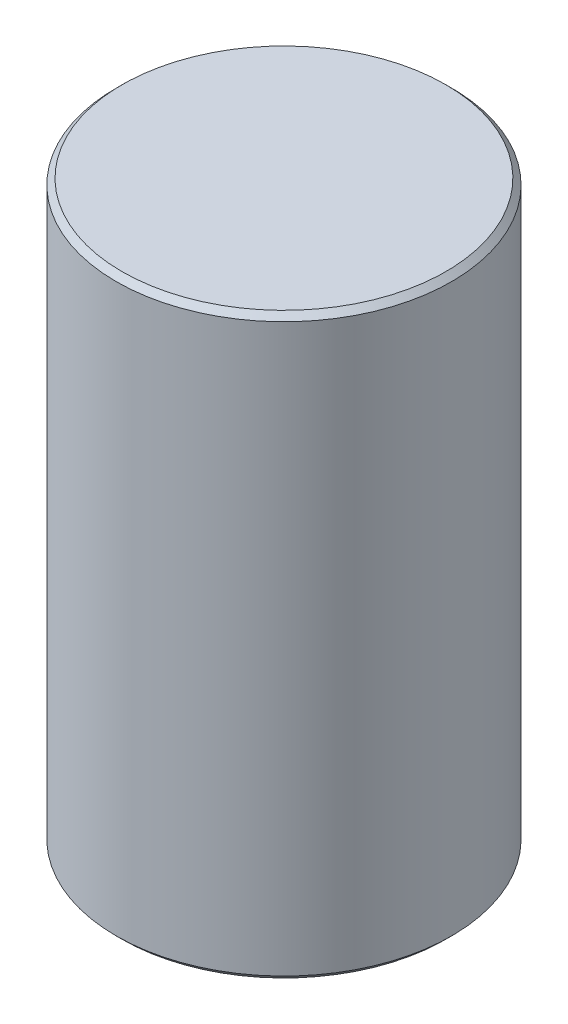
ISO-10303-21;
HEADER;
FILE_DESCRIPTION(('STEP AP214'),'2;1');
FILE_NAME('part.step','',(''),(''),'','','');
FILE_SCHEMA(('AUTOMOTIVE_DESIGN { 1 0 10303 214 1 1 1 1 }'));
ENDSEC;
DATA;
#1=APPLICATION_CONTEXT('core data for automotive mechanical design processes');
#2=APPLICATION_PROTOCOL_DEFINITION('international standard','automotive_design',2000,#1);
#3=PRODUCT_CONTEXT('',#1,'mechanical');
#4=PRODUCT('Part','Part','',(#3));
#5=PRODUCT_RELATED_PRODUCT_CATEGORY('part','',(#4));
#6=PRODUCT_DEFINITION_FORMATION('','',#4);
#7=PRODUCT_DEFINITION_CONTEXT('part definition',#1,'design');
#8=PRODUCT_DEFINITION('design','',#6,#7);
#9=PRODUCT_DEFINITION_SHAPE('','',#8);
#10=(LENGTH_UNIT() NAMED_UNIT(*) SI_UNIT(.MILLI.,.METRE.));
#11=(NAMED_UNIT(*) PLANE_ANGLE_UNIT() SI_UNIT($,.RADIAN.));
#12=(NAMED_UNIT(*) SI_UNIT($,.STERADIAN.) SOLID_ANGLE_UNIT());
#13=UNCERTAINTY_MEASURE_WITH_UNIT(LENGTH_MEASURE(1.E-05),#10,'distance_accuracy_value','');
#14=(GEOMETRIC_REPRESENTATION_CONTEXT(3) GLOBAL_UNCERTAINTY_ASSIGNED_CONTEXT((#13)) GLOBAL_UNIT_ASSIGNED_CONTEXT((#10,
#11,#12)) REPRESENTATION_CONTEXT('',''));
#15=CARTESIAN_POINT('',(0.,0.,0.));
#16=DIRECTION('',(0.,0.,1.));
#17=DIRECTION('',(1.,0.,0.));
#18=AXIS2_PLACEMENT_3D('',#15,#16,#17);
#19=CARTESIAN_POINT('',(0.,50.,0.));
#20=DIRECTION('',(0.,-1.,0.));
#21=DIRECTION('',(0.,0.,-1.));
#22=AXIS2_PLACEMENT_3D('',#19,#20,#21);
#23=CYLINDRICAL_SURFACE('',#22,14.5);
#24=CARTESIAN_POINT('',(0.,0.500000000000007,0.));
#25=DIRECTION('',(0.,1.,0.));
#26=DIRECTION('',(0.,0.,1.));
#27=AXIS2_PLACEMENT_3D('',#24,#25,#26);
#28=CIRCLE('',#27,14.5);
#29=CARTESIAN_POINT('',(0.,0.500000000000007,14.5));
#30=VERTEX_POINT('',#29);
#31=EDGE_CURVE('E567',#30,#30,#28,.T.);
#32=ORIENTED_EDGE('',*,*,#31,.T.);
#33=EDGE_LOOP('',(#32));
#34=FACE_BOUND('',#33,.T.);
#35=CARTESIAN_POINT('',(0.,49.5,0.));
#36=DIRECTION('',(0.,1.,0.));
#37=DIRECTION('',(0.,0.,1.));
#38=AXIS2_PLACEMENT_3D('',#35,#36,#37);
#39=CIRCLE('',#38,14.5);
#40=CARTESIAN_POINT('',(0.,49.5,14.5));
#41=VERTEX_POINT('',#40);
#42=EDGE_CURVE('E564',#41,#41,#39,.F.);
#43=ORIENTED_EDGE('',*,*,#42,.T.);
#44=EDGE_LOOP('',(#43));
#45=FACE_BOUND('',#44,.T.);
#46=ADVANCED_FACE('F137',(#34,#45),#23,.T.);
#47=CARTESIAN_POINT('',(0.,50.,0.));
#48=DIRECTION('',(0.,1.,0.));
#49=DIRECTION('',(0.,0.,1.));
#50=AXIS2_PLACEMENT_3D('',#47,#48,#49);
#51=PLANE('',#50);
#52=CARTESIAN_POINT('',(0.,50.,0.));
#53=DIRECTION('',(0.,1.,0.));
#54=DIRECTION('',(0.,0.,1.));
#55=AXIS2_PLACEMENT_3D('',#52,#53,#54);
#56=CIRCLE('',#55,14.);
#57=CARTESIAN_POINT('',(0.,50.,14.));
#58=VERTEX_POINT('',#57);
#59=EDGE_CURVE('E568',#58,#58,#56,.T.);
#60=ORIENTED_EDGE('',*,*,#59,.T.);
#61=EDGE_LOOP('',(#60));
#62=FACE_BOUND('',#61,.T.);
#63=ADVANCED_FACE('F472',(#62),#51,.T.);
#64=CARTESIAN_POINT('',(0.,0.,0.));
#65=DIRECTION('',(0.,1.,0.));
#66=DIRECTION('',(0.,0.,1.));
#67=AXIS2_PLACEMENT_3D('',#64,#65,#66);
#68=PLANE('',#67);
#69=CARTESIAN_POINT('',(0.,0.,0.));
#70=DIRECTION('',(0.,1.,0.));
#71=DIRECTION('',(0.,0.,1.));
#72=AXIS2_PLACEMENT_3D('',#69,#70,#71);
#73=CIRCLE('',#72,14.);
#74=CARTESIAN_POINT('',(0.,0.,14.));
#75=VERTEX_POINT('',#74);
#76=EDGE_CURVE('E342',#75,#75,#73,.F.);
#77=ORIENTED_EDGE('',*,*,#76,.T.);
#78=EDGE_LOOP('',(#77));
#79=FACE_BOUND('',#78,.T.);
#80=CARTESIAN_POINT('',(0.,0.,-12.7817252356636));
#81=DIRECTION('',(0.,-1.,0.));
#82=DIRECTION('',(0.,0.,-1.));
#83=AXIS2_PLACEMENT_3D('',#80,#81,#82);
#84=CIRCLE('',#83,1.1);
#85=CARTESIAN_POINT('',(0.,0.,-13.8817252356636));
#86=VERTEX_POINT('',#85);
#87=EDGE_CURVE('E744',#86,#86,#84,.T.);
#88=ORIENTED_EDGE('',*,*,#87,.F.);
#89=EDGE_LOOP('',(#88));
#90=FACE_BOUND('',#89,.T.);
#91=CARTESIAN_POINT('',(0.,0.,12.7817252356636));
#92=DIRECTION('',(0.,-1.,0.));
#93=DIRECTION('',(0.,0.,-1.));
#94=AXIS2_PLACEMENT_3D('',#91,#92,#93);
#95=CIRCLE('',#94,1.1);
#96=CARTESIAN_POINT('',(0.,0.,11.6817252356636));
#97=VERTEX_POINT('',#96);
#98=EDGE_CURVE('E674',#97,#97,#95,.T.);
#99=ORIENTED_EDGE('',*,*,#98,.F.);
#100=EDGE_LOOP('',(#99));
#101=FACE_BOUND('',#100,.T.);
#102=CARTESIAN_POINT('',(14.5,0.,0.));
#103=DIRECTION('',(0.,-1.,0.));
#104=DIRECTION('',(0.,0.,-1.));
#105=AXIS2_PLACEMENT_3D('',#102,#103,#104);
#106=CIRCLE('',#105,3.);
#107=CARTESIAN_POINT('',(11.6381823957492,0.,-0.9));
#108=VERTEX_POINT('',#107);
#109=CARTESIAN_POINT('',(13.022559490885,0.,-2.61097099601391));
#110=VERTEX_POINT('',#109);
#111=EDGE_CURVE('E577',#108,#110,#106,.T.);
#112=ORIENTED_EDGE('',*,*,#111,.T.);
#113=CARTESIAN_POINT('',(0.,0.,0.));
#114=DIRECTION('',(0.,1.,0.));
#115=DIRECTION('',(0.,0.,1.));
#116=AXIS2_PLACEMENT_3D('',#113,#114,#115);
#117=CIRCLE('',#116,13.2817252356636);
#118=CARTESIAN_POINT('',(2.99585149096341,0.,-12.9394396741032));
#119=VERTEX_POINT('',#118);
#120=EDGE_CURVE('E355',#110,#119,#117,.T.);
#121=ORIENTED_EDGE('',*,*,#120,.T.);
#122=CARTESIAN_POINT('',(0.,0.,-12.7817252356636));
#123=DIRECTION('',(0.,-1.,0.));
#124=DIRECTION('',(0.,0.,-1.));
#125=AXIS2_PLACEMENT_3D('',#122,#123,#124);
#126=CIRCLE('',#125,3.);
#127=CARTESIAN_POINT('',(-2.99585149096341,0.,-12.9394396741032));
#128=VERTEX_POINT('',#127);
#129=EDGE_CURVE('E584',#119,#128,#126,.T.);
#130=ORIENTED_EDGE('',*,*,#129,.T.);
#131=CARTESIAN_POINT('',(0.,0.,0.));
#132=DIRECTION('',(0.,1.,0.));
#133=DIRECTION('',(0.,0.,1.));
#134=AXIS2_PLACEMENT_3D('',#131,#132,#133);
#135=CIRCLE('',#134,13.2817252356636);
#136=CARTESIAN_POINT('',(-13.022559490885,0.,-2.61097099601391));
#137=VERTEX_POINT('',#136);
#138=EDGE_CURVE('E349',#128,#137,#135,.T.);
#139=ORIENTED_EDGE('',*,*,#138,.T.);
#140=CARTESIAN_POINT('',(-14.5,0.,0.));
#141=DIRECTION('',(0.,-1.,0.));
#142=DIRECTION('',(0.,0.,-1.));
#143=AXIS2_PLACEMENT_3D('',#140,#141,#142);
#144=CIRCLE('',#143,3.);
#145=CARTESIAN_POINT('',(-11.6381823957492,0.,-0.9));
#146=VERTEX_POINT('',#145);
#147=EDGE_CURVE('E592',#137,#146,#144,.T.);
#148=ORIENTED_EDGE('',*,*,#147,.T.);
#149=DIRECTION('',(1.,0.,0.));
#150=VECTOR('',#149,1.);
#151=CARTESIAN_POINT('',(0.,0.,-0.9));
#152=LINE('',#151,#150);
#153=CARTESIAN_POINT('',(-12.75,0.,-0.9));
#154=VERTEX_POINT('',#153);
#155=EDGE_CURVE('E328',#154,#146,#152,.T.);
#156=ORIENTED_EDGE('',*,*,#155,.F.);
#157=DIRECTION('',(0.,0.,1.));
#158=VECTOR('',#157,1.);
#159=CARTESIAN_POINT('',(-12.75,0.,0.));
#160=LINE('',#159,#158);
#161=CARTESIAN_POINT('',(-12.75,0.,0.9));
#162=VERTEX_POINT('',#161);
#163=EDGE_CURVE('E324',#154,#162,#160,.T.);
#164=ORIENTED_EDGE('',*,*,#163,.T.);
#165=DIRECTION('',(1.,0.,0.));
#166=VECTOR('',#165,1.);
#167=CARTESIAN_POINT('',(0.,0.,0.9));
#168=LINE('',#167,#166);
#169=CARTESIAN_POINT('',(-11.6381823957492,0.,0.9));
#170=VERTEX_POINT('',#169);
#171=EDGE_CURVE('E608',#162,#170,#168,.T.);
#172=ORIENTED_EDGE('',*,*,#171,.T.);
#173=CARTESIAN_POINT('',(-14.5,0.,0.));
#174=DIRECTION('',(0.,-1.,0.));
#175=DIRECTION('',(0.,0.,-1.));
#176=AXIS2_PLACEMENT_3D('',#173,#174,#175);
#177=CIRCLE('',#176,3.);
#178=CARTESIAN_POINT('',(-13.022559490885,0.,2.61097099601391));
#179=VERTEX_POINT('',#178);
#180=EDGE_CURVE('E606',#170,#179,#177,.T.);
#181=ORIENTED_EDGE('',*,*,#180,.T.);
#182=CARTESIAN_POINT('',(0.,0.,0.));
#183=DIRECTION('',(0.,1.,0.));
#184=DIRECTION('',(0.,0.,1.));
#185=AXIS2_PLACEMENT_3D('',#182,#183,#184);
#186=CIRCLE('',#185,13.2817252356636);
#187=CARTESIAN_POINT('',(-2.99585149096341,0.,12.9394396741032));
#188=VERTEX_POINT('',#187);
#189=EDGE_CURVE('E352',#179,#188,#186,.T.);
#190=ORIENTED_EDGE('',*,*,#189,.T.);
#191=CARTESIAN_POINT('',(0.,0.,12.7817252356636));
#192=DIRECTION('',(0.,-1.,0.));
#193=DIRECTION('',(0.,0.,-1.));
#194=AXIS2_PLACEMENT_3D('',#191,#192,#193);
#195=CIRCLE('',#194,3.);
#196=CARTESIAN_POINT('',(2.99585149096341,0.,12.9394396741032));
#197=VERTEX_POINT('',#196);
#198=EDGE_CURVE('E604',#188,#197,#195,.T.);
#199=ORIENTED_EDGE('',*,*,#198,.T.);
#200=CARTESIAN_POINT('',(0.,0.,0.));
#201=DIRECTION('',(0.,1.,0.));
#202=DIRECTION('',(0.,0.,1.));
#203=AXIS2_PLACEMENT_3D('',#200,#201,#202);
#204=CIRCLE('',#203,13.2817252356636);
#205=CARTESIAN_POINT('',(13.022559490885,0.,2.61097099601391));
#206=VERTEX_POINT('',#205);
#207=EDGE_CURVE('E346',#197,#206,#204,.T.);
#208=ORIENTED_EDGE('',*,*,#207,.T.);
#209=CARTESIAN_POINT('',(14.5,0.,0.));
#210=DIRECTION('',(0.,-1.,0.));
#211=DIRECTION('',(0.,0.,-1.));
#212=AXIS2_PLACEMENT_3D('',#209,#210,#211);
#213=CIRCLE('',#212,3.);
#214=CARTESIAN_POINT('',(11.6381823957492,0.,0.9));
#215=VERTEX_POINT('',#214);
#216=EDGE_CURVE('E601',#206,#215,#213,.T.);
#217=ORIENTED_EDGE('',*,*,#216,.T.);
#218=DIRECTION('',(1.,0.,0.));
#219=VECTOR('',#218,1.);
#220=CARTESIAN_POINT('',(0.,0.,0.9));
#221=LINE('',#220,#219);
#222=CARTESIAN_POINT('',(12.75,0.,0.9));
#223=VERTEX_POINT('',#222);
#224=EDGE_CURVE('E598',#215,#223,#221,.T.);
#225=ORIENTED_EDGE('',*,*,#224,.T.);
#226=DIRECTION('',(0.,0.,1.));
#227=VECTOR('',#226,1.);
#228=CARTESIAN_POINT('',(12.75,0.,0.));
#229=LINE('',#228,#227);
#230=CARTESIAN_POINT('',(12.75,0.,-0.9));
#231=VERTEX_POINT('',#230);
#232=EDGE_CURVE('E590',#231,#223,#229,.T.);
#233=ORIENTED_EDGE('',*,*,#232,.F.);
#234=DIRECTION('',(1.,0.,0.));
#235=VECTOR('',#234,1.);
#236=CARTESIAN_POINT('',(0.,0.,-0.9));
#237=LINE('',#236,#235);
#238=EDGE_CURVE('E588',#108,#231,#237,.T.);
#239=ORIENTED_EDGE('',*,*,#238,.F.);
#240=EDGE_LOOP('',(#112,#121,#130,#139,#148,#156,#164,#172,#181,#190,#199,#208,#217,#225,#233,#239));
#241=FACE_BOUND('',#240,.T.);
#242=ADVANCED_FACE('F478',(#79,#90,#101,#241),#68,.F.);
#243=CARTESIAN_POINT('',(0.,47.,-0.9));
#244=DIRECTION('',(0.,0.,-1.));
#245=DIRECTION('',(-1.,0.,0.));
#246=AXIS2_PLACEMENT_3D('',#243,#244,#245);
#247=PLANE('',#246);
#248=DIRECTION('',(1.,0.,0.));
#249=VECTOR('',#248,1.);
#250=CARTESIAN_POINT('',(0.,47.,-0.9));
#251=LINE('',#250,#249);
#252=CARTESIAN_POINT('',(-12.25,47.,-0.9));
#253=VERTEX_POINT('',#252);
#254=CARTESIAN_POINT('',(-11.6381823957492,47.,-0.9));
#255=VERTEX_POINT('',#254);
#256=EDGE_CURVE('E319',#253,#255,#251,.T.);
#257=ORIENTED_EDGE('',*,*,#256,.F.);
#258=DIRECTION('',(0.707106781186543,0.707106781186552,0.));
#259=VECTOR('',#258,1.);
#260=CARTESIAN_POINT('',(-12.75,46.5,-0.9));
#261=LINE('',#260,#259);
#262=CARTESIAN_POINT('',(-12.75,46.5,-0.9));
#263=VERTEX_POINT('',#262);
#264=EDGE_CURVE('E167',#253,#263,#261,.F.);
#265=ORIENTED_EDGE('',*,*,#264,.T.);
#266=DIRECTION('',(0.,-1.,0.));
#267=VECTOR('',#266,1.);
#268=CARTESIAN_POINT('',(-12.75,47.,-0.9));
#269=LINE('',#268,#267);
#270=EDGE_CURVE('E343',#263,#154,#269,.T.);
#271=ORIENTED_EDGE('',*,*,#270,.T.);
#272=ORIENTED_EDGE('',*,*,#155,.T.);
#273=DIRECTION('',(0.,-1.,0.));
#274=VECTOR('',#273,1.);
#275=CARTESIAN_POINT('',(-11.6381823957492,47.,-0.9));
#276=LINE('',#275,#274);
#277=EDGE_CURVE('E311',#255,#146,#276,.T.);
#278=ORIENTED_EDGE('',*,*,#277,.F.);
#279=EDGE_LOOP('',(#257,#265,#271,#272,#278));
#280=FACE_BOUND('',#279,.T.);
#281=ADVANCED_FACE('F326',(#280),#247,.F.);
#282=CARTESIAN_POINT('',(-12.75,47.,0.));
#283=DIRECTION('',(1.,0.,0.));
#284=DIRECTION('',(0.,0.,-1.));
#285=AXIS2_PLACEMENT_3D('',#282,#283,#284);
#286=PLANE('',#285);
#287=ORIENTED_EDGE('',*,*,#270,.F.);
#288=DIRECTION('',(0.,0.,1.));
#289=VECTOR('',#288,1.);
#290=CARTESIAN_POINT('',(-12.75,46.5,0.9));
#291=LINE('',#290,#289);
#292=CARTESIAN_POINT('',(-12.75,46.5,0.9));
#293=VERTEX_POINT('',#292);
#294=EDGE_CURVE('E560',#263,#293,#291,.T.);
#295=ORIENTED_EDGE('',*,*,#294,.T.);
#296=DIRECTION('',(0.,-1.,0.));
#297=VECTOR('',#296,1.);
#298=CARTESIAN_POINT('',(-12.75,47.,0.9));
#299=LINE('',#298,#297);
#300=EDGE_CURVE('E614',#293,#162,#299,.T.);
#301=ORIENTED_EDGE('',*,*,#300,.T.);
#302=ORIENTED_EDGE('',*,*,#163,.F.);
#303=EDGE_LOOP('',(#287,#295,#301,#302));
#304=FACE_BOUND('',#303,.T.);
#305=ADVANCED_FACE('F711',(#304),#286,.T.);
#306=CARTESIAN_POINT('',(0.,47.,0.9));
#307=DIRECTION('',(0.,0.,-1.));
#308=DIRECTION('',(-1.,0.,0.));
#309=AXIS2_PLACEMENT_3D('',#306,#307,#308);
#310=PLANE('',#309);
#311=ORIENTED_EDGE('',*,*,#300,.F.);
#312=DIRECTION('',(-0.707106781186543,-0.707106781186552,0.));
#313=VECTOR('',#312,1.);
#314=CARTESIAN_POINT('',(-6.12500000000008,53.125,0.9));
#315=LINE('',#314,#313);
#316=CARTESIAN_POINT('',(-12.25,47.,0.9));
#317=VERTEX_POINT('',#316);
#318=EDGE_CURVE('E159',#293,#317,#315,.F.);
#319=ORIENTED_EDGE('',*,*,#318,.T.);
#320=DIRECTION('',(1.,0.,0.));
#321=VECTOR('',#320,1.);
#322=CARTESIAN_POINT('',(0.,47.,0.9));
#323=LINE('',#322,#321);
#324=CARTESIAN_POINT('',(-11.6381823957492,47.,0.9));
#325=VERTEX_POINT('',#324);
#326=EDGE_CURVE('E330',#317,#325,#323,.T.);
#327=ORIENTED_EDGE('',*,*,#326,.T.);
#328=DIRECTION('',(0.,-1.,0.));
#329=VECTOR('',#328,1.);
#330=CARTESIAN_POINT('',(-11.6381823957492,47.,0.9));
#331=LINE('',#330,#329);
#332=EDGE_CURVE('E616',#325,#170,#331,.T.);
#333=ORIENTED_EDGE('',*,*,#332,.T.);
#334=ORIENTED_EDGE('',*,*,#171,.F.);
#335=EDGE_LOOP('',(#311,#319,#327,#333,#334));
#336=FACE_BOUND('',#335,.T.);
#337=ADVANCED_FACE('F525',(#336),#310,.T.);
#338=CARTESIAN_POINT('',(-14.5,47.,0.));
#339=DIRECTION('',(0.,-1.,0.));
#340=DIRECTION('',(0.,0.,-1.));
#341=AXIS2_PLACEMENT_3D('',#338,#339,#340);
#342=CYLINDRICAL_SURFACE('',#341,3.);
#343=ORIENTED_EDGE('',*,*,#180,.F.);
#344=ORIENTED_EDGE('',*,*,#332,.F.);
#345=CARTESIAN_POINT('',(-14.5,47.,0.));
#346=DIRECTION('',(0.,-1.,0.));
#347=DIRECTION('',(0.,0.,-1.));
#348=AXIS2_PLACEMENT_3D('',#345,#346,#347);
#349=CIRCLE('',#348,3.);
#350=CARTESIAN_POINT('',(-12.5731896551724,47.,2.29943512521345));
#351=VERTEX_POINT('',#350);
#352=EDGE_CURVE('E335',#325,#351,#349,.T.);
#353=ORIENTED_EDGE('',*,*,#352,.T.);
#354=DIRECTION('',(0.,-1.,0.));
#355=VECTOR('',#354,1.);
#356=CARTESIAN_POINT('',(-12.5731896551724,47.,2.29943512521345));
#357=LINE('',#356,#355);
#358=CARTESIAN_POINT('',(-12.5731896551724,0.5,2.29943512521345));
#359=VERTEX_POINT('',#358);
#360=EDGE_CURVE('E618',#351,#359,#357,.T.);
#361=ORIENTED_EDGE('',*,*,#360,.T.);
#362=CARTESIAN_POINT('',(-12.5731896551724,0.5,2.29943512521345));
#363=CARTESIAN_POINT('',(-12.608957242716,0.459423552953031,2.32940453587484));
#364=CARTESIAN_POINT('',(-12.6451937113484,0.418509493408417,2.35835047763427));
#365=CARTESIAN_POINT('',(-12.7184932891909,0.336147011445683,2.41419892236149));
#366=CARTESIAN_POINT('',(-12.7555553052425,0.294699323157264,2.44110394135731));
#367=CARTESIAN_POINT('',(-12.830484069167,0.211309145629597,2.49294843442544));
#368=CARTESIAN_POINT('',(-12.8683508001323,0.169366666794484,2.5178879497427));
#369=CARTESIAN_POINT('',(-12.9448817082479,0.0850077001829065,2.56586194167394));
#370=CARTESIAN_POINT('',(-12.9835468265613,0.0425906835808542,2.58889398815827));
#371=CARTESIAN_POINT('',(-13.022559490885,0.,2.61097099601391));
#372=B_SPLINE_CURVE_WITH_KNOTS('',3,(#362,#363,#364,#365,#366,#367,#368,#369,#370,#371),
.UNSPECIFIED.,.F.,.F.,(4,2,2,2,4),(0.,0.18549798373546,0.370763440178986,0.556025007899362,
0.741519081308244),.UNSPECIFIED.);
#373=EDGE_CURVE('E507',#359,#179,#372,.T.);
#374=ORIENTED_EDGE('',*,*,#373,.T.);
#375=EDGE_LOOP('',(#343,#344,#353,#361,#374));
#376=FACE_BOUND('',#375,.T.);
#377=ADVANCED_FACE('F519',(#376),#342,.T.);
#378=CARTESIAN_POINT('',(0.,47.,0.));
#379=DIRECTION('',(0.,-1.,0.));
#380=DIRECTION('',(0.,0.,-1.));
#381=AXIS2_PLACEMENT_3D('',#378,#379,#380);
#382=CYLINDRICAL_SURFACE('',#381,12.7817252356636);
#383=DIRECTION('',(0.,-1.,0.));
#384=VECTOR('',#383,1.);
#385=CARTESIAN_POINT('',(-2.97927006678414,47.,12.42966008663));
#386=LINE('',#385,#384);
#387=CARTESIAN_POINT('',(-2.97927006678414,47.,12.42966008663));
#388=VERTEX_POINT('',#387);
#389=CARTESIAN_POINT('',(-2.97927006678414,0.5,12.42966008663));
#390=VERTEX_POINT('',#389);
#391=EDGE_CURVE('E621',#388,#390,#386,.T.);
#392=ORIENTED_EDGE('',*,*,#391,.T.);
#393=CARTESIAN_POINT('',(0.,0.5,0.));
#394=DIRECTION('',(0.,1.,0.));
#395=DIRECTION('',(0.,0.,1.));
#396=AXIS2_PLACEMENT_3D('',#393,#394,#395);
#397=CIRCLE('',#396,12.7817252356636);
#398=EDGE_CURVE('E358',#390,#359,#397,.F.);
#399=ORIENTED_EDGE('',*,*,#398,.T.);
#400=ORIENTED_EDGE('',*,*,#360,.F.);
#401=CARTESIAN_POINT('',(0.,47.,0.));
#402=DIRECTION('',(0.,-1.,0.));
#403=DIRECTION('',(0.,0.,-1.));
#404=AXIS2_PLACEMENT_3D('',#401,#402,#403);
#405=CIRCLE('',#404,12.7817252356636);
#406=EDGE_CURVE('E668',#388,#351,#405,.T.);
#407=ORIENTED_EDGE('',*,*,#406,.F.);
#408=EDGE_LOOP('',(#392,#399,#400,#407));
#409=FACE_BOUND('',#408,.T.);
#410=ADVANCED_FACE('F524',(#409),#382,.F.);
#411=CARTESIAN_POINT('',(0.,47.,12.7817252356636));
#412=DIRECTION('',(0.,-1.,0.));
#413=DIRECTION('',(0.,0.,-1.));
#414=AXIS2_PLACEMENT_3D('',#411,#412,#413);
#415=CYLINDRICAL_SURFACE('',#414,3.);
#416=CARTESIAN_POINT('',(0.,47.,12.7817252356636));
#417=DIRECTION('',(0.,-1.,0.));
#418=DIRECTION('',(0.,0.,-1.));
#419=AXIS2_PLACEMENT_3D('',#416,#417,#418);
#420=CIRCLE('',#419,3.);
#421=CARTESIAN_POINT('',(2.87933239359176,47.,11.9394396741032));
#422=VERTEX_POINT('',#421);
#423=EDGE_CURVE('E667',#388,#422,#420,.T.);
#424=ORIENTED_EDGE('',*,*,#423,.T.);
#425=CARTESIAN_POINT('',(2.87933239359176,47.,11.9394396741032));
#426=CARTESIAN_POINT('',(2.90278899147045,46.9165448910448,12.0196325396067));
#427=CARTESIAN_POINT('',(2.92284542984264,46.8331506698992,12.1005806734036));
#428=CARTESIAN_POINT('',(2.95615798757301,46.6664840032325,12.2639874775793));
#429=CARTESIAN_POINT('',(2.96941410693161,46.5832115577114,12.346446147958));
#430=CARTESIAN_POINT('',(2.97927006678414,46.5,12.42966008663));
#431=B_SPLINE_CURVE_WITH_KNOTS('',3,(#425,#426,#427,#428,#429,#430),.UNSPECIFIED.,.F.,.F.,(4,2,
4),(0.,0.353815085677179,0.707630171332365),.UNSPECIFIED.);
#432=CARTESIAN_POINT('',(2.97927006678414,46.5,12.42966008663));
#433=VERTEX_POINT('',#432);
#434=EDGE_CURVE('E408',#422,#433,#431,.T.);
#435=ORIENTED_EDGE('',*,*,#434,.T.);
#436=DIRECTION('',(0.,-1.,0.));
#437=VECTOR('',#436,1.);
#438=CARTESIAN_POINT('',(2.97927006678414,47.,12.42966008663));
#439=LINE('',#438,#437);
#440=CARTESIAN_POINT('',(2.97927006678414,0.5,12.42966008663));
#441=VERTEX_POINT('',#440);
#442=EDGE_CURVE('E624',#433,#441,#439,.T.);
#443=ORIENTED_EDGE('',*,*,#442,.T.);
#444=CARTESIAN_POINT('',(2.97927006678414,0.5,12.42966008663));
#445=CARTESIAN_POINT('',(2.98423128730967,0.458012855053629,12.4716469993818));
#446=CARTESIAN_POINT('',(2.98831184564201,0.416076990484309,12.5137899845246));
#447=CARTESIAN_POINT('',(2.99468745541221,0.33238308153138,12.5983076713708));
#448=CARTESIAN_POINT('',(2.99698418141637,0.290624907062719,12.6406821180589));
#449=CARTESIAN_POINT('',(2.99977735560106,0.207282349679987,12.725661610187));
#450=CARTESIAN_POINT('',(3.00027379396999,0.165697967714322,12.7682666568824));
#451=CARTESIAN_POINT('',(2.99944081805709,0.0827009289538976,12.8537036801549));
#452=CARTESIAN_POINT('',(2.99810968560312,0.0412884705206803,12.8965358325154));
#453=CARTESIAN_POINT('',(2.99585149096341,0.,12.9394396741032));
#454=B_SPLINE_CURVE_WITH_KNOTS('',3,(#444,#445,#446,#447,#448,#449,#450,#451,#452,#453),
.UNSPECIFIED.,.F.,.F.,(4,2,2,2,4),(0.,0.178750578421158,0.357333151869611,0.535916698593732,
0.714668253840407),.UNSPECIFIED.);
#455=EDGE_CURVE('E152',#441,#197,#454,.T.);
#456=ORIENTED_EDGE('',*,*,#455,.T.);
#457=ORIENTED_EDGE('',*,*,#198,.F.);
#458=CARTESIAN_POINT('',(-2.99585149096341,0.,12.9394396741032));
#459=CARTESIAN_POINT('',(-2.99810968560312,0.0412884705206787,12.8965358325154));
#460=CARTESIAN_POINT('',(-2.99944081805709,0.0827009289538962,12.8537036801549));
#461=CARTESIAN_POINT('',(-3.00027379396999,0.165697967714321,12.7682666568824));
#462=CARTESIAN_POINT('',(-2.99977735560106,0.207282349679986,12.725661610187));
#463=CARTESIAN_POINT('',(-2.99698418141637,0.290624907062718,12.6406821180589));
#464=CARTESIAN_POINT('',(-2.99468745541221,0.33238308153138,12.5983076713708));
#465=CARTESIAN_POINT('',(-2.98831184564201,0.416076990484308,12.5137899845246));
#466=CARTESIAN_POINT('',(-2.98423128730967,0.458012855053628,12.4716469993818));
#467=CARTESIAN_POINT('',(-2.97927006678414,0.500000000000001,12.42966008663));
#468=B_SPLINE_CURVE_WITH_KNOTS('',3,(#458,#459,#460,#461,#462,#463,#464,#465,#466,#467),
.UNSPECIFIED.,.F.,.F.,(4,2,2,2,4),(0.,0.178751555246677,0.357335101970796,0.535917675419249,
0.714668253840408),.UNSPECIFIED.);
#469=EDGE_CURVE('E514',#188,#390,#468,.T.);
#470=ORIENTED_EDGE('',*,*,#469,.T.);
#471=ORIENTED_EDGE('',*,*,#391,.F.);
#472=EDGE_LOOP('',(#424,#435,#443,#456,#457,#470,#471));
#473=FACE_BOUND('',#472,.T.);
#474=ADVANCED_FACE('F529',(#473),#415,.T.);
#475=ORIENTED_EDGE('',*,*,#442,.F.);
#476=CARTESIAN_POINT('',(0.,46.5,0.));
#477=DIRECTION('',(0.,-1.,0.));
#478=DIRECTION('',(0.,0.,-1.));
#479=AXIS2_PLACEMENT_3D('',#476,#477,#478);
#480=CIRCLE('',#479,12.7817252356636);
#481=CARTESIAN_POINT('',(12.5731896551724,46.5,2.29943512521345));
#482=VERTEX_POINT('',#481);
#483=EDGE_CURVE('E554',#433,#482,#480,.F.);
#484=ORIENTED_EDGE('',*,*,#483,.T.);
#485=DIRECTION('',(0.,-1.,0.));
#486=VECTOR('',#485,1.);
#487=CARTESIAN_POINT('',(12.5731896551724,47.,2.29943512521345));
#488=LINE('',#487,#486);
#489=CARTESIAN_POINT('',(12.5731896551724,0.5,2.29943512521345));
#490=VERTEX_POINT('',#489);
#491=EDGE_CURVE('E627',#482,#490,#488,.T.);
#492=ORIENTED_EDGE('',*,*,#491,.T.);
#493=CARTESIAN_POINT('',(0.,0.5,0.));
#494=DIRECTION('',(0.,1.,0.));
#495=DIRECTION('',(0.,0.,1.));
#496=AXIS2_PLACEMENT_3D('',#493,#494,#495);
#497=CIRCLE('',#496,12.7817252356636);
#498=EDGE_CURVE('E692',#490,#441,#497,.F.);
#499=ORIENTED_EDGE('',*,*,#498,.T.);
#500=EDGE_LOOP('',(#475,#484,#492,#499));
#501=FACE_BOUND('',#500,.T.);
#502=ADVANCED_FACE('F531',(#501),#382,.F.);
#503=CARTESIAN_POINT('',(14.5,47.,0.));
#504=DIRECTION('',(0.,-1.,0.));
#505=DIRECTION('',(0.,0.,-1.));
#506=AXIS2_PLACEMENT_3D('',#503,#504,#505);
#507=CYLINDRICAL_SURFACE('',#506,3.);
#508=ORIENTED_EDGE('',*,*,#491,.F.);
#509=CARTESIAN_POINT('',(12.5731896551724,46.5,2.29943512521345));
#510=CARTESIAN_POINT('',(12.5346727394561,46.5436939119854,2.26715673289412));
#511=CARTESIAN_POINT('',(12.4966979641481,46.5869987092279,2.23369142098178));
#512=CARTESIAN_POINT('',(12.4220210291906,46.6725844362385,2.16439285974946));
#513=CARTESIAN_POINT('',(12.3853163882841,46.7148673071698,2.12856467717383));
#514=CARTESIAN_POINT('',(12.3132047701273,46.798349089648,2.05441031385449));
#515=CARTESIAN_POINT('',(12.2777978738588,46.8395479335044,2.01608397763441));
#516=CARTESIAN_POINT('',(12.2083488955752,46.9207472412799,1.93677941563639));
#517=CARTESIAN_POINT('',(12.1743098106466,46.9607450297168,1.89579583135718));
#518=CARTESIAN_POINT('',(12.1410611987702,47.,1.85348529318488));
#519=B_SPLINE_CURVE_WITH_KNOTS('',3,(#509,#510,#511,#512,#513,#514,#515,#516,#517,#518),
.UNSPECIFIED.,.F.,.F.,(4,2,2,2,4),(0.,0.199773754613091,0.399132246737546,0.598503158108041,
0.798289431807934),.UNSPECIFIED.);
#520=CARTESIAN_POINT('',(12.1410611987702,47.,1.85348529318488));
#521=VERTEX_POINT('',#520);
#522=EDGE_CURVE('E546',#482,#521,#519,.T.);
#523=ORIENTED_EDGE('',*,*,#522,.T.);
#524=CARTESIAN_POINT('',(14.5,47.,0.));
#525=DIRECTION('',(0.,-1.,0.));
#526=DIRECTION('',(0.,0.,-1.));
#527=AXIS2_PLACEMENT_3D('',#524,#525,#526);
#528=CIRCLE('',#527,3.);
#529=CARTESIAN_POINT('',(11.6381823957492,47.,0.9));
#530=VERTEX_POINT('',#529);
#531=EDGE_CURVE('E665',#521,#530,#528,.T.);
#532=ORIENTED_EDGE('',*,*,#531,.T.);
#533=DIRECTION('',(0.,-1.,0.));
#534=VECTOR('',#533,1.);
#535=CARTESIAN_POINT('',(11.6381823957492,47.,0.9));
#536=LINE('',#535,#534);
#537=EDGE_CURVE('E630',#530,#215,#536,.T.);
#538=ORIENTED_EDGE('',*,*,#537,.T.);
#539=ORIENTED_EDGE('',*,*,#216,.F.);
#540=CARTESIAN_POINT('',(13.022559490885,0.,2.61097099601391));
#541=CARTESIAN_POINT('',(12.9835468265613,0.0425906835808553,2.58889398815827));
#542=CARTESIAN_POINT('',(12.9448817082479,0.0850077001829078,2.56586194167394));
#543=CARTESIAN_POINT('',(12.8683508001323,0.169366666794485,2.51788794974271));
#544=CARTESIAN_POINT('',(12.830484069167,0.211309145629598,2.49294843442544));
#545=CARTESIAN_POINT('',(12.7555553052425,0.294699323157265,2.44110394135731));
#546=CARTESIAN_POINT('',(12.7184932891909,0.336147011445683,2.41419892236149));
#547=CARTESIAN_POINT('',(12.6451937113484,0.418509493408418,2.35835047763428));
#548=CARTESIAN_POINT('',(12.608957242716,0.459423552953032,2.32940453587485));
#549=CARTESIAN_POINT('',(12.5731896551724,0.500000000000001,2.29943512521345));
#550=B_SPLINE_CURVE_WITH_KNOTS('',3,(#540,#541,#542,#543,#544,#545,#546,#547,#548,#549),
.UNSPECIFIED.,.F.,.F.,(4,2,2,2,4),(0.,0.18549407340888,0.370755641129258,0.556021097572784,
0.741519081308244),.UNSPECIFIED.);
#551=EDGE_CURVE('E12',#206,#490,#550,.T.);
#552=ORIENTED_EDGE('',*,*,#551,.T.);
#553=EDGE_LOOP('',(#508,#523,#532,#538,#539,#552));
#554=FACE_BOUND('',#553,.T.);
#555=ADVANCED_FACE('F535',(#554),#507,.T.);
#556=CARTESIAN_POINT('',(0.,47.,0.9));
#557=DIRECTION('',(0.,0.,-1.));
#558=DIRECTION('',(-1.,0.,0.));
#559=AXIS2_PLACEMENT_3D('',#556,#557,#558);
#560=PLANE('',#559);
#561=DIRECTION('',(1.,0.,0.));
#562=VECTOR('',#561,1.);
#563=CARTESIAN_POINT('',(0.,47.,0.9));
#564=LINE('',#563,#562);
#565=CARTESIAN_POINT('',(12.25,47.,0.9));
#566=VERTEX_POINT('',#565);
#567=EDGE_CURVE('E662',#530,#566,#564,.T.);
#568=ORIENTED_EDGE('',*,*,#567,.T.);
#569=DIRECTION('',(0.707106781186548,-0.707106781186548,0.));
#570=VECTOR('',#569,1.);
#571=CARTESIAN_POINT('',(6.125,53.125,0.9));
#572=LINE('',#571,#570);
#573=CARTESIAN_POINT('',(12.75,46.5,0.9));
#574=VERTEX_POINT('',#573);
#575=EDGE_CURVE('E553',#566,#574,#572,.T.);
#576=ORIENTED_EDGE('',*,*,#575,.T.);
#577=DIRECTION('',(0.,-1.,0.));
#578=VECTOR('',#577,1.);
#579=CARTESIAN_POINT('',(12.75,47.,0.9));
#580=LINE('',#579,#578);
#581=EDGE_CURVE('E632',#574,#223,#580,.T.);
#582=ORIENTED_EDGE('',*,*,#581,.T.);
#583=ORIENTED_EDGE('',*,*,#224,.F.);
#584=ORIENTED_EDGE('',*,*,#537,.F.);
#585=EDGE_LOOP('',(#568,#576,#582,#583,#584));
#586=FACE_BOUND('',#585,.T.);
#587=ADVANCED_FACE('F541',(#586),#560,.T.);
#588=CARTESIAN_POINT('',(12.75,47.,0.));
#589=DIRECTION('',(1.,0.,0.));
#590=DIRECTION('',(0.,0.,-1.));
#591=AXIS2_PLACEMENT_3D('',#588,#589,#590);
#592=PLANE('',#591);
#593=ORIENTED_EDGE('',*,*,#581,.F.);
#594=DIRECTION('',(0.,0.,-1.));
#595=VECTOR('',#594,1.);
#596=CARTESIAN_POINT('',(12.75,46.5,0.));
#597=LINE('',#596,#595);
#598=CARTESIAN_POINT('',(12.75,46.5,-0.9));
#599=VERTEX_POINT('',#598);
#600=EDGE_CURVE('E556',#574,#599,#597,.T.);
#601=ORIENTED_EDGE('',*,*,#600,.T.);
#602=DIRECTION('',(0.,-1.,0.));
#603=VECTOR('',#602,1.);
#604=CARTESIAN_POINT('',(12.75,47.,-0.9));
#605=LINE('',#604,#603);
#606=EDGE_CURVE('E634',#599,#231,#605,.T.);
#607=ORIENTED_EDGE('',*,*,#606,.T.);
#608=ORIENTED_EDGE('',*,*,#232,.T.);
#609=EDGE_LOOP('',(#593,#601,#607,#608));
#610=FACE_BOUND('',#609,.T.);
#611=ADVANCED_FACE('F815',(#610),#592,.F.);
#612=CARTESIAN_POINT('',(0.,47.,-0.9));
#613=DIRECTION('',(0.,0.,-1.));
#614=DIRECTION('',(-1.,0.,0.));
#615=AXIS2_PLACEMENT_3D('',#612,#613,#614);
#616=PLANE('',#615);
#617=ORIENTED_EDGE('',*,*,#606,.F.);
#618=DIRECTION('',(-0.707106781186548,0.707106781186548,0.));
#619=VECTOR('',#618,1.);
#620=CARTESIAN_POINT('',(12.25,47.,-0.9));
#621=LINE('',#620,#619);
#622=CARTESIAN_POINT('',(12.25,47.,-0.9));
#623=VERTEX_POINT('',#622);
#624=EDGE_CURVE('E558',#599,#623,#621,.T.);
#625=ORIENTED_EDGE('',*,*,#624,.T.);
#626=DIRECTION('',(1.,0.,0.));
#627=VECTOR('',#626,1.);
#628=CARTESIAN_POINT('',(0.,47.,-0.9));
#629=LINE('',#628,#627);
#630=CARTESIAN_POINT('',(11.6381823957492,47.,-0.9));
#631=VERTEX_POINT('',#630);
#632=EDGE_CURVE('E659',#631,#623,#629,.T.);
#633=ORIENTED_EDGE('',*,*,#632,.F.);
#634=DIRECTION('',(0.,-1.,0.));
#635=VECTOR('',#634,1.);
#636=CARTESIAN_POINT('',(11.6381823957492,47.,-0.9));
#637=LINE('',#636,#635);
#638=EDGE_CURVE('E636',#631,#108,#637,.T.);
#639=ORIENTED_EDGE('',*,*,#638,.T.);
#640=ORIENTED_EDGE('',*,*,#238,.T.);
#641=EDGE_LOOP('',(#617,#625,#633,#639,#640));
#642=FACE_BOUND('',#641,.T.);
#643=ADVANCED_FACE('F823',(#642),#616,.F.);
#644=CARTESIAN_POINT('',(14.5,47.,0.));
#645=DIRECTION('',(0.,-1.,0.));
#646=DIRECTION('',(0.,0.,-1.));
#647=AXIS2_PLACEMENT_3D('',#644,#645,#646);
#648=CYLINDRICAL_SURFACE('',#647,3.);
#649=ORIENTED_EDGE('',*,*,#111,.F.);
#650=ORIENTED_EDGE('',*,*,#638,.F.);
#651=CARTESIAN_POINT('',(14.5,47.,0.));
#652=DIRECTION('',(0.,-1.,0.));
#653=DIRECTION('',(0.,0.,-1.));
#654=AXIS2_PLACEMENT_3D('',#651,#652,#653);
#655=CIRCLE('',#654,3.);
#656=CARTESIAN_POINT('',(12.5731896551724,47.,-2.29943512521345));
#657=VERTEX_POINT('',#656);
#658=EDGE_CURVE('E655',#631,#657,#655,.T.);
#659=ORIENTED_EDGE('',*,*,#658,.T.);
#660=DIRECTION('',(0.,-1.,0.));
#661=VECTOR('',#660,1.);
#662=CARTESIAN_POINT('',(12.5731896551724,47.,-2.29943512521345));
#663=LINE('',#662,#661);
#664=CARTESIAN_POINT('',(12.5731896551724,0.5,-2.29943512521345));
#665=VERTEX_POINT('',#664);
#666=EDGE_CURVE('E580',#657,#665,#663,.T.);
#667=ORIENTED_EDGE('',*,*,#666,.T.);
#668=CARTESIAN_POINT('',(12.5731896551724,0.5,-2.29943512521345));
#669=CARTESIAN_POINT('',(12.608957242716,0.459423552953031,-2.32940453587484));
#670=CARTESIAN_POINT('',(12.6451937113484,0.418509493408417,-2.35835047763428));
#671=CARTESIAN_POINT('',(12.7184932891909,0.336147011445683,-2.41419892236149));
#672=CARTESIAN_POINT('',(12.7555553052425,0.294699323157264,-2.44110394135731));
#673=CARTESIAN_POINT('',(12.830484069167,0.211309145629597,-2.49294843442544));
#674=CARTESIAN_POINT('',(12.8683508001323,0.169366666794485,-2.51788794974271));
#675=CARTESIAN_POINT('',(12.9448817082479,0.085007700182907,-2.56586194167394));
#676=CARTESIAN_POINT('',(12.9835468265613,0.0425906835808545,-2.58889398815827));
#677=CARTESIAN_POINT('',(13.022559490885,0.,-2.61097099601391));
#678=B_SPLINE_CURVE_WITH_KNOTS('',3,(#668,#669,#670,#671,#672,#673,#674,#675,#676,#677),
.UNSPECIFIED.,.F.,.F.,(4,2,2,2,4),(0.,0.185497983735461,0.370763440178986,0.556025007899363,
0.741519081308243),.UNSPECIFIED.);
#679=EDGE_CURVE('E493',#665,#110,#678,.T.);
#680=ORIENTED_EDGE('',*,*,#679,.T.);
#681=EDGE_LOOP('',(#649,#650,#659,#667,#680));
#682=FACE_BOUND('',#681,.T.);
#683=ADVANCED_FACE('F576',(#682),#648,.T.);
#684=CARTESIAN_POINT('',(0.,47.,0.));
#685=DIRECTION('',(0.,-1.,0.));
#686=DIRECTION('',(0.,0.,-1.));
#687=AXIS2_PLACEMENT_3D('',#684,#685,#686);
#688=CYLINDRICAL_SURFACE('',#687,12.7817252356636);
#689=DIRECTION('',(0.,-1.,0.));
#690=VECTOR('',#689,1.);
#691=CARTESIAN_POINT('',(2.97927006678414,47.,-12.42966008663));
#692=LINE('',#691,#690);
#693=CARTESIAN_POINT('',(2.97927006678414,47.,-12.42966008663));
#694=VERTEX_POINT('',#693);
#695=CARTESIAN_POINT('',(2.97927006678414,0.5,-12.42966008663));
#696=VERTEX_POINT('',#695);
#697=EDGE_CURVE('E639',#694,#696,#692,.T.);
#698=ORIENTED_EDGE('',*,*,#697,.T.);
#699=CARTESIAN_POINT('',(0.,0.5,0.));
#700=DIRECTION('',(0.,1.,0.));
#701=DIRECTION('',(0.,0.,1.));
#702=AXIS2_PLACEMENT_3D('',#699,#700,#701);
#703=CIRCLE('',#702,12.7817252356636);
#704=EDGE_CURVE('E339',#696,#665,#703,.F.);
#705=ORIENTED_EDGE('',*,*,#704,.T.);
#706=ORIENTED_EDGE('',*,*,#666,.F.);
#707=CARTESIAN_POINT('',(0.,47.,0.));
#708=DIRECTION('',(0.,-1.,0.));
#709=DIRECTION('',(0.,0.,-1.));
#710=AXIS2_PLACEMENT_3D('',#707,#708,#709);
#711=CIRCLE('',#710,12.7817252356636);
#712=EDGE_CURVE('E653',#694,#657,#711,.T.);
#713=ORIENTED_EDGE('',*,*,#712,.F.);
#714=EDGE_LOOP('',(#698,#705,#706,#713));
#715=FACE_BOUND('',#714,.T.);
#716=ADVANCED_FACE('F841',(#715),#688,.F.);
#717=CARTESIAN_POINT('',(0.,47.,-12.7817252356636));
#718=DIRECTION('',(0.,-1.,0.));
#719=DIRECTION('',(0.,0.,-1.));
#720=AXIS2_PLACEMENT_3D('',#717,#718,#719);
#721=CYLINDRICAL_SURFACE('',#720,3.);
#722=CARTESIAN_POINT('',(0.,47.,-12.7817252356636));
#723=DIRECTION('',(0.,-1.,0.));
#724=DIRECTION('',(0.,0.,-1.));
#725=AXIS2_PLACEMENT_3D('',#722,#723,#724);
#726=CIRCLE('',#725,3.);
#727=CARTESIAN_POINT('',(-2.87933239359176,47.,-11.9394396741032));
#728=VERTEX_POINT('',#727);
#729=EDGE_CURVE('E318',#694,#728,#726,.T.);
#730=ORIENTED_EDGE('',*,*,#729,.T.);
#731=CARTESIAN_POINT('',(-2.87933239359176,47.,-11.9394396741032));
#732=CARTESIAN_POINT('',(-2.90278899147044,46.9165448910448,-12.0196325396067));
#733=CARTESIAN_POINT('',(-2.92284542984263,46.8331506698992,-12.1005806734036));
#734=CARTESIAN_POINT('',(-2.95615798757301,46.6664840032325,-12.2639874775793));
#735=CARTESIAN_POINT('',(-2.96941410693161,46.5832115577114,-12.346446147958));
#736=CARTESIAN_POINT('',(-2.97927006678414,46.5,-12.42966008663));
#737=B_SPLINE_CURVE_WITH_KNOTS('',3,(#731,#732,#733,#734,#735,#736),.UNSPECIFIED.,.F.,.F.,(4,2,
4),(0.,0.353815085677189,0.707630171332387),.UNSPECIFIED.);
#738=CARTESIAN_POINT('',(-2.97927006678414,46.5,-12.42966008663));
#739=VERTEX_POINT('',#738);
#740=EDGE_CURVE('E370',#728,#739,#737,.T.);
#741=ORIENTED_EDGE('',*,*,#740,.T.);
#742=DIRECTION('',(0.,-1.,0.));
#743=VECTOR('',#742,1.);
#744=CARTESIAN_POINT('',(-2.97927006678414,47.,-12.42966008663));
#745=LINE('',#744,#743);
#746=CARTESIAN_POINT('',(-2.97927006678414,0.5,-12.42966008663));
#747=VERTEX_POINT('',#746);
#748=EDGE_CURVE('E333',#739,#747,#745,.T.);
#749=ORIENTED_EDGE('',*,*,#748,.T.);
#750=CARTESIAN_POINT('',(-2.97927006678414,0.5,-12.42966008663));
#751=CARTESIAN_POINT('',(-2.98423128730967,0.458012855053628,-12.4716469993818));
#752=CARTESIAN_POINT('',(-2.98831184564201,0.416076990484308,-12.5137899845246));
#753=CARTESIAN_POINT('',(-2.99468745541221,0.332383081531379,-12.5983076713708));
#754=CARTESIAN_POINT('',(-2.99698418141637,0.290624907062718,-12.6406821180589));
#755=CARTESIAN_POINT('',(-2.99977735560106,0.207282349679985,-12.725661610187));
#756=CARTESIAN_POINT('',(-3.00027379396999,0.16569796771432,-12.7682666568824));
#757=CARTESIAN_POINT('',(-2.99944081805709,0.0827009289538956,-12.8537036801549));
#758=CARTESIAN_POINT('',(-2.99810968560312,0.0412884705206784,-12.8965358325154));
#759=CARTESIAN_POINT('',(-2.99585149096341,0.,-12.9394396741032));
#760=B_SPLINE_CURVE_WITH_KNOTS('',3,(#750,#751,#752,#753,#754,#755,#756,#757,#758,#759),
.UNSPECIFIED.,.F.,.F.,(4,2,2,2,4),(0.,0.178750578421159,0.357333151869612,0.535916698593732,
0.714668253840406),.UNSPECIFIED.);
#761=EDGE_CURVE('E430',#747,#128,#760,.T.);
#762=ORIENTED_EDGE('',*,*,#761,.T.);
#763=ORIENTED_EDGE('',*,*,#129,.F.);
#764=CARTESIAN_POINT('',(2.99585149096341,0.,-12.9394396741032));
#765=CARTESIAN_POINT('',(2.99810968560312,0.0412884705206787,-12.8965358325154));
#766=CARTESIAN_POINT('',(2.99944081805709,0.0827009289538962,-12.8537036801549));
#767=CARTESIAN_POINT('',(3.00027379396999,0.165697967714321,-12.7682666568824));
#768=CARTESIAN_POINT('',(2.99977735560106,0.207282349679986,-12.725661610187));
#769=CARTESIAN_POINT('',(2.99698418141637,0.290624907062718,-12.6406821180589));
#770=CARTESIAN_POINT('',(2.99468745541221,0.33238308153138,-12.5983076713708));
#771=CARTESIAN_POINT('',(2.98831184564201,0.416076990484308,-12.5137899845246));
#772=CARTESIAN_POINT('',(2.98423128730967,0.458012855053628,-12.4716469993818));
#773=CARTESIAN_POINT('',(2.97927006678414,0.500000000000001,-12.42966008663));
#774=B_SPLINE_CURVE_WITH_KNOTS('',3,(#764,#765,#766,#767,#768,#769,#770,#771,#772,#773),
.UNSPECIFIED.,.F.,.F.,(4,2,2,2,4),(0.,0.178751555246677,0.357335101970796,0.535917675419249,
0.714668253840408),.UNSPECIFIED.);
#775=EDGE_CURVE('E501',#119,#696,#774,.T.);
#776=ORIENTED_EDGE('',*,*,#775,.T.);
#777=ORIENTED_EDGE('',*,*,#697,.F.);
#778=EDGE_LOOP('',(#730,#741,#749,#762,#763,#776,#777));
#779=FACE_BOUND('',#778,.T.);
#780=ADVANCED_FACE('F380',(#779),#721,.T.);
#781=ORIENTED_EDGE('',*,*,#748,.F.);
#782=CARTESIAN_POINT('',(0.,46.5,0.));
#783=DIRECTION('',(0.,-1.,0.));
#784=DIRECTION('',(0.,0.,-1.));
#785=AXIS2_PLACEMENT_3D('',#782,#783,#784);
#786=CIRCLE('',#785,12.7817252356636);
#787=CARTESIAN_POINT('',(-12.5731896551724,46.5,-2.29943512521345));
#788=VERTEX_POINT('',#787);
#789=EDGE_CURVE('E409',#739,#788,#786,.F.);
#790=ORIENTED_EDGE('',*,*,#789,.T.);
#791=DIRECTION('',(0.,-1.,0.));
#792=VECTOR('',#791,1.);
#793=CARTESIAN_POINT('',(-12.5731896551724,47.,-2.29943512521345));
#794=LINE('',#793,#792);
#795=CARTESIAN_POINT('',(-12.5731896551724,0.5,-2.29943512521345));
#796=VERTEX_POINT('',#795);
#797=EDGE_CURVE('E329',#788,#796,#794,.T.);
#798=ORIENTED_EDGE('',*,*,#797,.T.);
#799=CARTESIAN_POINT('',(0.,0.5,0.));
#800=DIRECTION('',(0.,1.,0.));
#801=DIRECTION('',(0.,0.,1.));
#802=AXIS2_PLACEMENT_3D('',#799,#800,#801);
#803=CIRCLE('',#802,12.7817252356636);
#804=EDGE_CURVE('E378',#796,#747,#803,.F.);
#805=ORIENTED_EDGE('',*,*,#804,.T.);
#806=EDGE_LOOP('',(#781,#790,#798,#805));
#807=FACE_BOUND('',#806,.T.);
#808=ADVANCED_FACE('F419',(#807),#688,.F.);
#809=CARTESIAN_POINT('',(-14.5,47.,0.));
#810=DIRECTION('',(0.,-1.,0.));
#811=DIRECTION('',(0.,0.,-1.));
#812=AXIS2_PLACEMENT_3D('',#809,#810,#811);
#813=CYLINDRICAL_SURFACE('',#812,3.);
#814=ORIENTED_EDGE('',*,*,#797,.F.);
#815=CARTESIAN_POINT('',(-12.5731896551724,46.5,-2.29943512521345));
#816=CARTESIAN_POINT('',(-12.5346727394561,46.5436939119854,-2.26715673289412));
#817=CARTESIAN_POINT('',(-12.496697964148,46.5869987092279,-2.23369142098178));
#818=CARTESIAN_POINT('',(-12.4220210291906,46.6725844362385,-2.16439285974945));
#819=CARTESIAN_POINT('',(-12.3853163882841,46.7148673071698,-2.12856467717381));
#820=CARTESIAN_POINT('',(-12.3132047701273,46.798349089648,-2.05441031385447));
#821=CARTESIAN_POINT('',(-12.2777978738588,46.8395479335044,-2.01608397763439));
#822=CARTESIAN_POINT('',(-12.2083488955752,46.9207472412799,-1.93677941563637));
#823=CARTESIAN_POINT('',(-12.1743098106465,46.9607450297168,-1.89579583135716));
#824=CARTESIAN_POINT('',(-12.1410611987702,47.,-1.85348529318486));
#825=B_SPLINE_CURVE_WITH_KNOTS('',3,(#815,#816,#817,#818,#819,#820,#821,#822,#823,#824),
.UNSPECIFIED.,.F.,.F.,(4,2,2,2,4),(0.,0.199773754613102,0.399132246737568,0.598503158108069,
0.798289431807961),.UNSPECIFIED.);
#826=CARTESIAN_POINT('',(-12.1410611987702,47.,-1.85348529318486));
#827=VERTEX_POINT('',#826);
#828=EDGE_CURVE('E314',#788,#827,#825,.T.);
#829=ORIENTED_EDGE('',*,*,#828,.T.);
#830=CARTESIAN_POINT('',(-14.5,47.,0.));
#831=DIRECTION('',(0.,-1.,0.));
#832=DIRECTION('',(0.,0.,-1.));
#833=AXIS2_PLACEMENT_3D('',#830,#831,#832);
#834=CIRCLE('',#833,3.);
#835=EDGE_CURVE('E306',#827,#255,#834,.T.);
#836=ORIENTED_EDGE('',*,*,#835,.T.);
#837=ORIENTED_EDGE('',*,*,#277,.T.);
#838=ORIENTED_EDGE('',*,*,#147,.F.);
#839=CARTESIAN_POINT('',(-13.022559490885,0.,-2.61097099601391));
#840=CARTESIAN_POINT('',(-12.9835468265613,0.0425906835808558,-2.58889398815827));
#841=CARTESIAN_POINT('',(-12.9448817082479,0.0850077001829082,-2.56586194167394));
#842=CARTESIAN_POINT('',(-12.8683508001323,0.169366666794485,-2.5178879497427));
#843=CARTESIAN_POINT('',(-12.830484069167,0.211309145629597,-2.49294843442544));
#844=CARTESIAN_POINT('',(-12.7555553052425,0.294699323157263,-2.44110394135731));
#845=CARTESIAN_POINT('',(-12.7184932891909,0.336147011445681,-2.41419892236149));
#846=CARTESIAN_POINT('',(-12.6451937113484,0.418509493408416,-2.35835047763427));
#847=CARTESIAN_POINT('',(-12.608957242716,0.45942355295303,-2.32940453587484));
#848=CARTESIAN_POINT('',(-12.5731896551724,0.5,-2.29943512521345));
#849=B_SPLINE_CURVE_WITH_KNOTS('',3,(#839,#840,#841,#842,#843,#844,#845,#846,#847,#848),
.UNSPECIFIED.,.F.,.F.,(4,2,2,2,4),(0.,0.18549407340888,0.370755641129255,0.556021097572779,
0.74151908130824),.UNSPECIFIED.);
#850=EDGE_CURVE('E423',#137,#796,#849,.T.);
#851=ORIENTED_EDGE('',*,*,#850,.T.);
#852=EDGE_LOOP('',(#814,#829,#836,#837,#838,#851));
#853=FACE_BOUND('',#852,.T.);
#854=ADVANCED_FACE('F309',(#853),#813,.T.);
#855=CARTESIAN_POINT('',(0.,47.,0.));
#856=DIRECTION('',(0.,-1.,0.));
#857=DIRECTION('',(0.,0.,-1.));
#858=AXIS2_PLACEMENT_3D('',#855,#856,#857);
#859=PLANE('',#858);
#860=ORIENTED_EDGE('',*,*,#835,.F.);
#861=CARTESIAN_POINT('',(0.,47.,0.));
#862=DIRECTION('',(0.,-1.,0.));
#863=DIRECTION('',(0.,0.,-1.));
#864=AXIS2_PLACEMENT_3D('',#861,#862,#863);
#865=CIRCLE('',#864,12.2817252356636);
#866=EDGE_CURVE('E368',#827,#728,#865,.T.);
#867=ORIENTED_EDGE('',*,*,#866,.T.);
#868=ORIENTED_EDGE('',*,*,#729,.F.);
#869=ORIENTED_EDGE('',*,*,#712,.T.);
#870=ORIENTED_EDGE('',*,*,#658,.F.);
#871=ORIENTED_EDGE('',*,*,#632,.T.);
#872=DIRECTION('',(0.,0.,1.));
#873=VECTOR('',#872,1.);
#874=CARTESIAN_POINT('',(12.25,47.,0.));
#875=LINE('',#874,#873);
#876=EDGE_CURVE('E362',#623,#566,#875,.T.);
#877=ORIENTED_EDGE('',*,*,#876,.T.);
#878=ORIENTED_EDGE('',*,*,#567,.F.);
#879=ORIENTED_EDGE('',*,*,#531,.F.);
#880=CARTESIAN_POINT('',(0.,47.,0.));
#881=DIRECTION('',(0.,-1.,0.));
#882=DIRECTION('',(0.,0.,-1.));
#883=AXIS2_PLACEMENT_3D('',#880,#881,#882);
#884=CIRCLE('',#883,12.2817252356636);
#885=EDGE_CURVE('E365',#521,#422,#884,.T.);
#886=ORIENTED_EDGE('',*,*,#885,.T.);
#887=ORIENTED_EDGE('',*,*,#423,.F.);
#888=ORIENTED_EDGE('',*,*,#406,.T.);
#889=ORIENTED_EDGE('',*,*,#352,.F.);
#890=ORIENTED_EDGE('',*,*,#326,.F.);
#891=DIRECTION('',(0.,0.,-1.));
#892=VECTOR('',#891,1.);
#893=CARTESIAN_POINT('',(-12.25,47.,-0.9));
#894=LINE('',#893,#892);
#895=EDGE_CURVE('E323',#317,#253,#894,.T.);
#896=ORIENTED_EDGE('',*,*,#895,.T.);
#897=ORIENTED_EDGE('',*,*,#256,.T.);
#898=EDGE_LOOP('',(#860,#867,#868,#869,#870,#871,#877,#878,#879,#886,#887,#888,#889,#890,#896,#897));
#899=FACE_BOUND('',#898,.T.);
#900=ADVANCED_FACE('F321',(#899),#859,.T.);
#901=CARTESIAN_POINT('',(0.,47.,12.7817252356636));
#902=DIRECTION('',(0.,-1.,0.));
#903=DIRECTION('',(0.,0.,-1.));
#904=AXIS2_PLACEMENT_3D('',#901,#902,#903);
#905=CYLINDRICAL_SURFACE('',#904,1.1);
#906=CARTESIAN_POINT('',(0.,47.,12.7817252356636));
#907=DIRECTION('',(0.,-1.,0.));
#908=DIRECTION('',(0.,0.,-1.));
#909=AXIS2_PLACEMENT_3D('',#906,#907,#908);
#910=CIRCLE('',#909,1.1);
#911=CARTESIAN_POINT('',(0.,47.,11.6817252356636));
#912=VERTEX_POINT('',#911);
#913=EDGE_CURVE('E739',#912,#912,#910,.T.);
#914=ORIENTED_EDGE('',*,*,#913,.F.);
#915=EDGE_LOOP('',(#914));
#916=FACE_BOUND('',#915,.T.);
#917=ORIENTED_EDGE('',*,*,#98,.T.);
#918=EDGE_LOOP('',(#917));
#919=FACE_BOUND('',#918,.T.);
#920=ADVANCED_FACE('F720',(#916,#919),#905,.F.);
#921=CARTESIAN_POINT('',(0.,47.,12.7817252356636));
#922=DIRECTION('',(0.,-1.,0.));
#923=DIRECTION('',(0.,0.,-1.));
#924=AXIS2_PLACEMENT_3D('',#921,#922,#923);
#925=PLANE('',#924);
#926=ORIENTED_EDGE('',*,*,#913,.T.);
#927=EDGE_LOOP('',(#926));
#928=FACE_BOUND('',#927,.T.);
#929=ADVANCED_FACE('F727',(#928),#925,.T.);
#930=CARTESIAN_POINT('',(0.,47.,-12.7817252356636));
#931=DIRECTION('',(0.,-1.,0.));
#932=DIRECTION('',(0.,0.,-1.));
#933=AXIS2_PLACEMENT_3D('',#930,#931,#932);
#934=CYLINDRICAL_SURFACE('',#933,1.1);
#935=CARTESIAN_POINT('',(0.,47.,-12.7817252356636));
#936=DIRECTION('',(0.,-1.,0.));
#937=DIRECTION('',(0.,0.,-1.));
#938=AXIS2_PLACEMENT_3D('',#935,#936,#937);
#939=CIRCLE('',#938,1.1);
#940=CARTESIAN_POINT('',(0.,47.,-13.8817252356636));
#941=VERTEX_POINT('',#940);
#942=EDGE_CURVE('E749',#941,#941,#939,.T.);
#943=ORIENTED_EDGE('',*,*,#942,.F.);
#944=EDGE_LOOP('',(#943));
#945=FACE_BOUND('',#944,.T.);
#946=ORIENTED_EDGE('',*,*,#87,.T.);
#947=EDGE_LOOP('',(#946));
#948=FACE_BOUND('',#947,.T.);
#949=ADVANCED_FACE('F723',(#945,#948),#934,.F.);
#950=CARTESIAN_POINT('',(0.,47.,-12.7817252356636));
#951=DIRECTION('',(0.,-1.,0.));
#952=DIRECTION('',(0.,0.,-1.));
#953=AXIS2_PLACEMENT_3D('',#950,#951,#952);
#954=PLANE('',#953);
#955=ORIENTED_EDGE('',*,*,#942,.T.);
#956=EDGE_LOOP('',(#955));
#957=FACE_BOUND('',#956,.T.);
#958=ADVANCED_FACE('F489',(#957),#954,.T.);
#959=CARTESIAN_POINT('',(0.,0.5,0.));
#960=DIRECTION('',(0.,-1.,0.));
#961=DIRECTION('',(0.,0.,-1.));
#962=AXIS2_PLACEMENT_3D('',#959,#960,#961);
#963=CONICAL_SURFACE('',#962,12.7817252356636,0.785398163397452);
#964=ORIENTED_EDGE('',*,*,#775,.F.);
#965=ORIENTED_EDGE('',*,*,#120,.F.);
#966=ORIENTED_EDGE('',*,*,#679,.F.);
#967=ORIENTED_EDGE('',*,*,#704,.F.);
#968=EDGE_LOOP('',(#964,#965,#966,#967));
#969=FACE_BOUND('',#968,.T.);
#970=ADVANCED_FACE('F484',(#969),#963,.F.);
#971=CARTESIAN_POINT('',(0.,0.5,0.));
#972=DIRECTION('',(0.,-1.,0.));
#973=DIRECTION('',(0.,0.,-1.));
#974=AXIS2_PLACEMENT_3D('',#971,#972,#973);
#975=CONICAL_SURFACE('',#974,12.7817252356636,0.785398163397452);
#976=ORIENTED_EDGE('',*,*,#469,.F.);
#977=ORIENTED_EDGE('',*,*,#189,.F.);
#978=ORIENTED_EDGE('',*,*,#373,.F.);
#979=ORIENTED_EDGE('',*,*,#398,.F.);
#980=EDGE_LOOP('',(#976,#977,#978,#979));
#981=FACE_BOUND('',#980,.T.);
#982=ADVANCED_FACE('F395',(#981),#975,.F.);
#983=CARTESIAN_POINT('',(0.,47.,0.));
#984=DIRECTION('',(0.,-1.,0.));
#985=DIRECTION('',(0.,0.,-1.));
#986=AXIS2_PLACEMENT_3D('',#983,#984,#985);
#987=CONICAL_SURFACE('',#986,12.2817252356636,0.785398163397452);
#988=ORIENTED_EDGE('',*,*,#828,.F.);
#989=ORIENTED_EDGE('',*,*,#789,.F.);
#990=ORIENTED_EDGE('',*,*,#740,.F.);
#991=ORIENTED_EDGE('',*,*,#866,.F.);
#992=EDGE_LOOP('',(#988,#989,#990,#991));
#993=FACE_BOUND('',#992,.T.);
#994=ADVANCED_FACE('F385',(#993),#987,.F.);
#995=CARTESIAN_POINT('',(0.,47.,0.));
#996=DIRECTION('',(0.,-1.,0.));
#997=DIRECTION('',(0.,0.,-1.));
#998=AXIS2_PLACEMENT_3D('',#995,#996,#997);
#999=CONICAL_SURFACE('',#998,12.2817252356636,0.785398163397448);
#1000=ORIENTED_EDGE('',*,*,#522,.F.);
#1001=ORIENTED_EDGE('',*,*,#483,.F.);
#1002=ORIENTED_EDGE('',*,*,#434,.F.);
#1003=ORIENTED_EDGE('',*,*,#885,.F.);
#1004=EDGE_LOOP('',(#1000,#1001,#1002,#1003));
#1005=FACE_BOUND('',#1004,.T.);
#1006=ADVANCED_FACE('F394',(#1005),#999,.F.);
#1007=CARTESIAN_POINT('',(12.25,47.,0.));
#1008=DIRECTION('',(0.707106781186547,0.707106781186547,0.));
#1009=DIRECTION('',(0.,0.,1.));
#1010=AXIS2_PLACEMENT_3D('',#1007,#1008,#1009);
#1011=PLANE('',#1010);
#1012=ORIENTED_EDGE('',*,*,#624,.F.);
#1013=ORIENTED_EDGE('',*,*,#600,.F.);
#1014=ORIENTED_EDGE('',*,*,#575,.F.);
#1015=ORIENTED_EDGE('',*,*,#876,.F.);
#1016=EDGE_LOOP('',(#1012,#1013,#1014,#1015));
#1017=FACE_BOUND('',#1016,.T.);
#1018=ADVANCED_FACE('F906',(#1017),#1011,.F.);
#1019=CARTESIAN_POINT('',(-12.75,46.5,0.));
#1020=DIRECTION('',(0.707106781186552,-0.707106781186543,0.));
#1021=DIRECTION('',(0.,0.,-1.));
#1022=AXIS2_PLACEMENT_3D('',#1019,#1020,#1021);
#1023=PLANE('',#1022);
#1024=ORIENTED_EDGE('',*,*,#264,.F.);
#1025=ORIENTED_EDGE('',*,*,#895,.F.);
#1026=ORIENTED_EDGE('',*,*,#318,.F.);
#1027=ORIENTED_EDGE('',*,*,#294,.F.);
#1028=EDGE_LOOP('',(#1024,#1025,#1026,#1027));
#1029=FACE_BOUND('',#1028,.T.);
#1030=ADVANCED_FACE('F450',(#1029),#1023,.T.);
#1031=CARTESIAN_POINT('',(0.,0.5,0.));
#1032=DIRECTION('',(0.,-1.,0.));
#1033=DIRECTION('',(0.,0.,-1.));
#1034=AXIS2_PLACEMENT_3D('',#1031,#1032,#1033);
#1035=CONICAL_SURFACE('',#1034,12.7817252356636,0.78539816339745);
#1036=ORIENTED_EDGE('',*,*,#850,.F.);
#1037=ORIENTED_EDGE('',*,*,#138,.F.);
#1038=ORIENTED_EDGE('',*,*,#761,.F.);
#1039=ORIENTED_EDGE('',*,*,#804,.F.);
#1040=EDGE_LOOP('',(#1036,#1037,#1038,#1039));
#1041=FACE_BOUND('',#1040,.T.);
#1042=ADVANCED_FACE('F441',(#1041),#1035,.F.);
#1043=CARTESIAN_POINT('',(0.,0.5,0.));
#1044=DIRECTION('',(0.,-1.,0.));
#1045=DIRECTION('',(0.,0.,-1.));
#1046=AXIS2_PLACEMENT_3D('',#1043,#1044,#1045);
#1047=CONICAL_SURFACE('',#1046,12.7817252356636,0.785398163397454);
#1048=ORIENTED_EDGE('',*,*,#551,.F.);
#1049=ORIENTED_EDGE('',*,*,#207,.F.);
#1050=ORIENTED_EDGE('',*,*,#455,.F.);
#1051=ORIENTED_EDGE('',*,*,#498,.F.);
#1052=EDGE_LOOP('',(#1048,#1049,#1050,#1051));
#1053=FACE_BOUND('',#1052,.T.);
#1054=ADVANCED_FACE('F449',(#1053),#1047,.F.);
#1055=CARTESIAN_POINT('',(0.,0.500000000000007,0.));
#1056=DIRECTION('',(0.,1.,0.));
#1057=DIRECTION('',(0.,0.,1.));
#1058=AXIS2_PLACEMENT_3D('',#1055,#1056,#1057);
#1059=CONICAL_SURFACE('',#1058,14.5,0.785398163397448);
#1060=ORIENTED_EDGE('',*,*,#76,.F.);
#1061=EDGE_LOOP('',(#1060));
#1062=FACE_BOUND('',#1061,.T.);
#1063=ORIENTED_EDGE('',*,*,#31,.F.);
#1064=EDGE_LOOP('',(#1063));
#1065=FACE_BOUND('',#1064,.T.);
#1066=ADVANCED_FACE('F458',(#1062,#1065),#1059,.T.);
#1067=CARTESIAN_POINT('',(0.,50.,0.));
#1068=DIRECTION('',(0.,-1.,0.));
#1069=DIRECTION('',(0.,0.,-1.));
#1070=AXIS2_PLACEMENT_3D('',#1067,#1068,#1069);
#1071=CONICAL_SURFACE('',#1070,14.,0.785398163397448);
#1072=ORIENTED_EDGE('',*,*,#42,.F.);
#1073=EDGE_LOOP('',(#1072));
#1074=FACE_BOUND('',#1073,.T.);
#1075=ORIENTED_EDGE('',*,*,#59,.F.);
#1076=EDGE_LOOP('',(#1075));
#1077=FACE_BOUND('',#1076,.T.);
#1078=ADVANCED_FACE('F140',(#1074,#1077),#1071,.T.);
#1079=CLOSED_SHELL('',(#46,#63,#242,#281,#305,#337,#377,#410,#474,#502,#555,#587,#611,#643,#683,
#716,#780,#808,#854,#900,#920,#929,#949,#958,#970,#982,#994,#1006,#1018,#1030,#1042,#1054,#1066,#1078));
#1080=MANIFOLD_SOLID_BREP('B2',#1079);
#1081=ADVANCED_BREP_SHAPE_REPRESENTATION('',(#18,#1080),#14);
#1082=SHAPE_DEFINITION_REPRESENTATION(#9,#1081);
ENDSEC;
END-ISO-10303-21;
